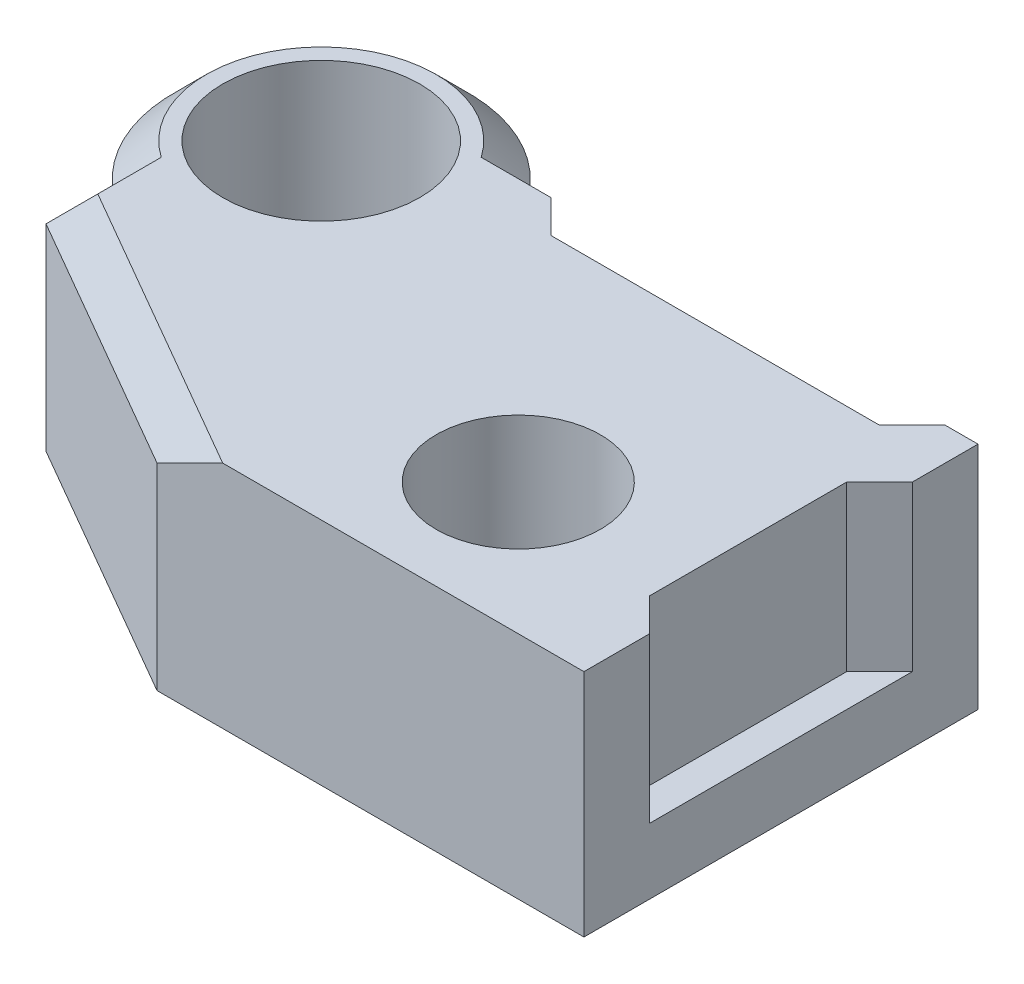
ISO-10303-21;
HEADER;
FILE_DESCRIPTION(('STEP AP214'),'2;1');
FILE_NAME('part.step','',(''),(''),'','','');
FILE_SCHEMA(('AUTOMOTIVE_DESIGN { 1 0 10303 214 1 1 1 1 }'));
ENDSEC;
DATA;
#1=APPLICATION_CONTEXT('core data for automotive mechanical design processes');
#2=APPLICATION_PROTOCOL_DEFINITION('international standard','automotive_design',2000,#1);
#3=PRODUCT_CONTEXT('',#1,'mechanical');
#4=PRODUCT('Part','Part','',(#3));
#5=PRODUCT_RELATED_PRODUCT_CATEGORY('part','',(#4));
#6=PRODUCT_DEFINITION_FORMATION('','',#4);
#7=PRODUCT_DEFINITION_CONTEXT('part definition',#1,'design');
#8=PRODUCT_DEFINITION('design','',#6,#7);
#9=PRODUCT_DEFINITION_SHAPE('','',#8);
#10=(LENGTH_UNIT() NAMED_UNIT(*) SI_UNIT(.MILLI.,.METRE.));
#11=(NAMED_UNIT(*) PLANE_ANGLE_UNIT() SI_UNIT($,.RADIAN.));
#12=(NAMED_UNIT(*) SI_UNIT($,.STERADIAN.) SOLID_ANGLE_UNIT());
#13=UNCERTAINTY_MEASURE_WITH_UNIT(LENGTH_MEASURE(1.E-05),#10,'distance_accuracy_value','');
#14=(GEOMETRIC_REPRESENTATION_CONTEXT(3) GLOBAL_UNCERTAINTY_ASSIGNED_CONTEXT((#13)) GLOBAL_UNIT_ASSIGNED_CONTEXT((#10,
#11,#12)) REPRESENTATION_CONTEXT('',''));
#15=CARTESIAN_POINT('',(0.,0.,0.));
#16=DIRECTION('',(0.,0.,1.));
#17=DIRECTION('',(1.,0.,0.));
#18=AXIS2_PLACEMENT_3D('',#15,#16,#17);
#19=CARTESIAN_POINT('',(-4.84435562925362,35.,-20.));
#20=DIRECTION('',(0.,0.,-1.));
#21=DIRECTION('',(-1.,0.,0.));
#22=AXIS2_PLACEMENT_3D('',#19,#20,#21);
#23=PLANE('',#22);
#24=DIRECTION('',(-1.,0.,0.));
#25=VECTOR('',#24,1.);
#26=CARTESIAN_POINT('',(0.,10.,-20.));
#27=LINE('',#26,#25);
#28=CARTESIAN_POINT('',(60.,10.,-20.));
#29=VERTEX_POINT('',#28);
#30=CARTESIAN_POINT('',(0.,10.,-20.));
#31=VERTEX_POINT('',#30);
#32=EDGE_CURVE('E172',#29,#31,#27,.T.);
#33=ORIENTED_EDGE('',*,*,#32,.F.);
#34=DIRECTION('',(0.,-1.,0.));
#35=VECTOR('',#34,1.);
#36=CARTESIAN_POINT('',(60.,95.2079728939615,-20.));
#37=LINE('',#36,#35);
#38=CARTESIAN_POINT('',(60.,35.,-20.));
#39=VERTEX_POINT('',#38);
#40=EDGE_CURVE('E157',#39,#29,#37,.T.);
#41=ORIENTED_EDGE('',*,*,#40,.F.);
#42=DIRECTION('',(1.,0.,0.));
#43=VECTOR('',#42,1.);
#44=CARTESIAN_POINT('',(-4.84435562925362,35.,-20.));
#45=LINE('',#44,#43);
#46=CARTESIAN_POINT('',(65.,35.,-20.));
#47=VERTEX_POINT('',#46);
#48=EDGE_CURVE('E169',#39,#47,#45,.T.);
#49=ORIENTED_EDGE('',*,*,#48,.T.);
#50=DIRECTION('',(0.,-1.,0.));
#51=VECTOR('',#50,1.);
#52=CARTESIAN_POINT('',(65.,35.,-20.));
#53=LINE('',#52,#51);
#54=CARTESIAN_POINT('',(65.,0.,-20.));
#55=VERTEX_POINT('',#54);
#56=EDGE_CURVE('E196',#47,#55,#53,.T.);
#57=ORIENTED_EDGE('',*,*,#56,.T.);
#58=DIRECTION('',(1.,0.,0.));
#59=VECTOR('',#58,1.);
#60=CARTESIAN_POINT('',(-4.84435562925362,0.,-20.));
#61=LINE('',#60,#59);
#62=CARTESIAN_POINT('',(-4.84435562925362,0.,-20.));
#63=VERTEX_POINT('',#62);
#64=EDGE_CURVE('E197',#63,#55,#61,.T.);
#65=ORIENTED_EDGE('',*,*,#64,.F.);
#66=DIRECTION('',(0.,-1.,0.));
#67=VECTOR('',#66,1.);
#68=CARTESIAN_POINT('',(-4.84435562925362,35.,-20.));
#69=LINE('',#68,#67);
#70=CARTESIAN_POINT('',(-4.84435562925362,30.,-20.));
#71=VERTEX_POINT('',#70);
#72=EDGE_CURVE('E212',#71,#63,#69,.T.);
#73=ORIENTED_EDGE('',*,*,#72,.F.);
#74=CARTESIAN_POINT('',(-4.84435562925362,30.,-20.));
#75=CARTESIAN_POINT('',(-5.08190477445998,30.2127955591723,-20.));
#76=CARTESIAN_POINT('',(-5.31982059114856,30.4251818299175,-20.));
#77=CARTESIAN_POINT('',(-5.796463680219,30.8490437473834,-20.));
#78=CARTESIAN_POINT('',(-6.03519095596736,31.0605193903179,-20.));
#79=CARTESIAN_POINT('',(-6.75264825460754,31.6933903284911,-20.));
#80=CARTESIAN_POINT('',(-7.23270925683391,32.1132794326035,-20.));
#81=CARTESIAN_POINT('',(-8.19716627857497,32.948098839902,-20.));
#82=CARTESIAN_POINT('',(-8.68156247165042,33.3630289429857,-20.));
#83=CARTESIAN_POINT('',(-9.41217401975395,33.9807278020433,-20.));
#84=CARTESIAN_POINT('',(-9.65639478827387,34.1858562705367,-20.));
#85=CARTESIAN_POINT('',(-10.146332216397,34.5943246195466,-20.));
#86=CARTESIAN_POINT('',(-10.3920488945089,34.7976644778563,-20.));
#87=CARTESIAN_POINT('',(-10.6385933836549,35.,-20.));
#88=B_SPLINE_CURVE_WITH_KNOTS('',3,(#74,#75,#76,#77,#78,#79,#80,#81,#82,#83,#84,#85,#86,#87),
.UNSPECIFIED.,.F.,.F.,(4,2,2,2,2,2,4),(0.,0.95676675045147,1.91353747508659,3.82685521218492,
5.74024989531519,6.69705637838347,7.65387472402372),.UNSPECIFIED.);
#89=CARTESIAN_POINT('',(-10.6385933836549,35.,-20.));
#90=VERTEX_POINT('',#89);
#91=EDGE_CURVE('E11',#71,#90,#88,.T.);
#92=ORIENTED_EDGE('',*,*,#91,.T.);
#93=CARTESIAN_POINT('',(0.,35.,-20.));
#94=VERTEX_POINT('',#93);
#95=EDGE_CURVE('E181',#90,#94,#45,.T.);
#96=ORIENTED_EDGE('',*,*,#95,.T.);
#97=DIRECTION('',(0.,-1.,0.));
#98=VECTOR('',#97,1.);
#99=CARTESIAN_POINT('',(0.,95.2079728939615,-20.));
#100=LINE('',#99,#98);
#101=EDGE_CURVE('E296',#94,#31,#100,.T.);
#102=ORIENTED_EDGE('',*,*,#101,.T.);
#103=EDGE_LOOP('',(#33,#41,#49,#57,#65,#73,#92,#96,#102));
#104=FACE_BOUND('',#103,.T.);
#105=ADVANCED_FACE('F35',(#104),#23,.T.);
#106=CARTESIAN_POINT('',(65.,35.,-20.));
#107=DIRECTION('',(1.,0.,0.));
#108=DIRECTION('',(0.,0.,-1.));
#109=AXIS2_PLACEMENT_3D('',#106,#107,#108);
#110=PLANE('',#109);
#111=DIRECTION('',(0.,0.,-1.));
#112=VECTOR('',#111,1.);
#113=CARTESIAN_POINT('',(65.,10.,-10.));
#114=LINE('',#113,#112);
#115=CARTESIAN_POINT('',(65.,10.,30.));
#116=VERTEX_POINT('',#115);
#117=CARTESIAN_POINT('',(65.,10.,-10.));
#118=VERTEX_POINT('',#117);
#119=EDGE_CURVE('E310',#116,#118,#114,.T.);
#120=ORIENTED_EDGE('',*,*,#119,.F.);
#121=DIRECTION('',(0.,-1.,0.));
#122=VECTOR('',#121,1.);
#123=CARTESIAN_POINT('',(65.,95.2079728939615,30.));
#124=LINE('',#123,#122);
#125=CARTESIAN_POINT('',(65.,35.,30.));
#126=VERTEX_POINT('',#125);
#127=EDGE_CURVE('E276',#126,#116,#124,.T.);
#128=ORIENTED_EDGE('',*,*,#127,.F.);
#129=DIRECTION('',(0.,0.,1.));
#130=VECTOR('',#129,1.);
#131=CARTESIAN_POINT('',(65.,35.,-20.));
#132=LINE('',#131,#130);
#133=CARTESIAN_POINT('',(65.,35.,40.));
#134=VERTEX_POINT('',#133);
#135=EDGE_CURVE('E185',#126,#134,#132,.T.);
#136=ORIENTED_EDGE('',*,*,#135,.T.);
#137=DIRECTION('',(0.,-1.,0.));
#138=VECTOR('',#137,1.);
#139=CARTESIAN_POINT('',(65.,35.,40.));
#140=LINE('',#139,#138);
#141=CARTESIAN_POINT('',(65.,0.,40.));
#142=VERTEX_POINT('',#141);
#143=EDGE_CURVE('E221',#134,#142,#140,.T.);
#144=ORIENTED_EDGE('',*,*,#143,.T.);
#145=DIRECTION('',(0.,0.,1.));
#146=VECTOR('',#145,1.);
#147=CARTESIAN_POINT('',(65.,0.,-20.));
#148=LINE('',#147,#146);
#149=EDGE_CURVE('E200',#55,#142,#148,.T.);
#150=ORIENTED_EDGE('',*,*,#149,.F.);
#151=ORIENTED_EDGE('',*,*,#56,.F.);
#152=CARTESIAN_POINT('',(65.,35.,-10.));
#153=VERTEX_POINT('',#152);
#154=EDGE_CURVE('E180',#47,#153,#132,.T.);
#155=ORIENTED_EDGE('',*,*,#154,.T.);
#156=DIRECTION('',(0.,-1.,0.));
#157=VECTOR('',#156,1.);
#158=CARTESIAN_POINT('',(65.,95.2079728939615,-10.));
#159=LINE('',#158,#157);
#160=EDGE_CURVE('E309',#153,#118,#159,.T.);
#161=ORIENTED_EDGE('',*,*,#160,.T.);
#162=EDGE_LOOP('',(#120,#128,#136,#144,#150,#151,#155,#161));
#163=FACE_BOUND('',#162,.T.);
#164=ADVANCED_FACE('F252',(#163),#110,.T.);
#165=CARTESIAN_POINT('',(-25.,35.,-10.));
#166=DIRECTION('',(0.,1.,0.));
#167=DIRECTION('',(0.,0.,1.));
#168=AXIS2_PLACEMENT_3D('',#165,#166,#167);
#169=PLANE('',#168);
#170=ORIENTED_EDGE('',*,*,#95,.F.);
#171=CARTESIAN_POINT('',(-25.,35.,-10.));
#172=DIRECTION('',(0.,1.,0.));
#173=DIRECTION('',(0.,0.,1.));
#174=AXIS2_PLACEMENT_3D('',#171,#172,#173);
#175=CIRCLE('',#174,17.5);
#176=CARTESIAN_POINT('',(-35.,35.,4.36140661634506));
#177=VERTEX_POINT('',#176);
#178=EDGE_CURVE('E231',#90,#177,#175,.T.);
#179=ORIENTED_EDGE('',*,*,#178,.T.);
#180=DIRECTION('',(0.,0.,1.));
#181=VECTOR('',#180,1.);
#182=CARTESIAN_POINT('',(-35.,35.,16.9059892324149));
#183=LINE('',#182,#181);
#184=CARTESIAN_POINT('',(-35.,35.,14.0192378864668));
#185=VERTEX_POINT('',#184);
#186=EDGE_CURVE('E214',#177,#185,#183,.T.);
#187=ORIENTED_EDGE('',*,*,#186,.T.);
#188=DIRECTION('',(0.866025403784438,0.,0.500000000000001));
#189=VECTOR('',#188,1.);
#190=CARTESIAN_POINT('',(2.5,35.,35.6698729810778));
#191=LINE('',#190,#189);
#192=CARTESIAN_POINT('',(9.99999999999998,35.,40.));
#193=VERTEX_POINT('',#192);
#194=EDGE_CURVE('E233',#185,#193,#191,.T.);
#195=ORIENTED_EDGE('',*,*,#194,.T.);
#196=DIRECTION('',(1.,0.,0.));
#197=VECTOR('',#196,1.);
#198=CARTESIAN_POINT('',(0.,35.,40.));
#199=LINE('',#198,#197);
#200=EDGE_CURVE('E194',#193,#134,#199,.T.);
#201=ORIENTED_EDGE('',*,*,#200,.T.);
#202=ORIENTED_EDGE('',*,*,#135,.F.);
#203=DIRECTION('',(0.70710678118655,0.,0.707106781186545));
#204=VECTOR('',#203,1.);
#205=CARTESIAN_POINT('',(60.,35.,25.));
#206=LINE('',#205,#204);
#207=CARTESIAN_POINT('',(60.,35.,25.));
#208=VERTEX_POINT('',#207);
#209=EDGE_CURVE('E313',#208,#126,#206,.T.);
#210=ORIENTED_EDGE('',*,*,#209,.F.);
#211=DIRECTION('',(0.,0.,1.));
#212=VECTOR('',#211,1.);
#213=CARTESIAN_POINT('',(60.,35.,-4.99999999999997));
#214=LINE('',#213,#212);
#215=CARTESIAN_POINT('',(60.,35.,-4.99999999999997));
#216=VERTEX_POINT('',#215);
#217=EDGE_CURVE('E305',#216,#208,#214,.T.);
#218=ORIENTED_EDGE('',*,*,#217,.F.);
#219=DIRECTION('',(-0.707106781186546,0.,0.707106781186549));
#220=VECTOR('',#219,1.);
#221=CARTESIAN_POINT('',(60.,35.,-4.99999999999997));
#222=LINE('',#221,#220);
#223=EDGE_CURVE('E302',#153,#216,#222,.T.);
#224=ORIENTED_EDGE('',*,*,#223,.F.);
#225=ORIENTED_EDGE('',*,*,#154,.F.);
#226=ORIENTED_EDGE('',*,*,#48,.F.);
#227=DIRECTION('',(0.707106781186547,0.,-0.707106781186548));
#228=VECTOR('',#227,1.);
#229=CARTESIAN_POINT('',(55.,35.,-15.));
#230=LINE('',#229,#228);
#231=CARTESIAN_POINT('',(55.,35.,-15.));
#232=VERTEX_POINT('',#231);
#233=EDGE_CURVE('E153',#232,#39,#230,.T.);
#234=ORIENTED_EDGE('',*,*,#233,.F.);
#235=DIRECTION('',(1.,0.,0.));
#236=VECTOR('',#235,1.);
#237=CARTESIAN_POINT('',(5.00000000000001,35.,-15.));
#238=LINE('',#237,#236);
#239=CARTESIAN_POINT('',(5.00000000000001,35.,-15.));
#240=VERTEX_POINT('',#239);
#241=EDGE_CURVE('E165',#240,#232,#238,.T.);
#242=ORIENTED_EDGE('',*,*,#241,.F.);
#243=DIRECTION('',(0.707106781186551,0.,0.707106781186544));
#244=VECTOR('',#243,1.);
#245=CARTESIAN_POINT('',(5.00000000000001,35.,-15.));
#246=LINE('',#245,#244);
#247=EDGE_CURVE('E164',#94,#240,#246,.T.);
#248=ORIENTED_EDGE('',*,*,#247,.F.);
#249=EDGE_LOOP('',(#170,#179,#187,#195,#201,#202,#210,#218,#224,#225,#226,#234,#242,#248));
#250=FACE_BOUND('',#249,.T.);
#251=CARTESIAN_POINT('',(35.,35.,20.));
#252=DIRECTION('',(0.,1.,0.));
#253=DIRECTION('',(0.,0.,1.));
#254=AXIS2_PLACEMENT_3D('',#251,#252,#253);
#255=CIRCLE('',#254,12.5);
#256=CARTESIAN_POINT('',(35.,35.,32.5));
#257=VERTEX_POINT('',#256);
#258=EDGE_CURVE('E227',#257,#257,#255,.T.);
#259=ORIENTED_EDGE('',*,*,#258,.F.);
#260=EDGE_LOOP('',(#259));
#261=FACE_BOUND('',#260,.T.);
#262=CARTESIAN_POINT('',(-25.,35.,-10.));
#263=DIRECTION('',(0.,1.,0.));
#264=DIRECTION('',(0.,0.,1.));
#265=AXIS2_PLACEMENT_3D('',#262,#263,#264);
#266=CIRCLE('',#265,15.);
#267=CARTESIAN_POINT('',(-25.,35.,5.));
#268=VERTEX_POINT('',#267);
#269=EDGE_CURVE('E191',#268,#268,#266,.T.);
#270=ORIENTED_EDGE('',*,*,#269,.F.);
#271=EDGE_LOOP('',(#270));
#272=FACE_BOUND('',#271,.T.);
#273=ADVANCED_FACE('F176',(#250,#261,#272),#169,.T.);
#274=CARTESIAN_POINT('',(-25.,35.,-10.));
#275=DIRECTION('',(0.,-1.,0.));
#276=DIRECTION('',(0.,0.,-1.));
#277=AXIS2_PLACEMENT_3D('',#274,#275,#276);
#278=CYLINDRICAL_SURFACE('',#277,22.5);
#279=DIRECTION('',(0.,-1.,0.));
#280=VECTOR('',#279,1.);
#281=CARTESIAN_POINT('',(-40.,35.,6.77050983124841));
#282=LINE('',#281,#280);
#283=CARTESIAN_POINT('',(-40.,30.,6.77050983124841));
#284=VERTEX_POINT('',#283);
#285=CARTESIAN_POINT('',(-40.,0.,6.77050983124841));
#286=VERTEX_POINT('',#285);
#287=EDGE_CURVE('E215',#284,#286,#282,.T.);
#288=ORIENTED_EDGE('',*,*,#287,.F.);
#289=CARTESIAN_POINT('',(-25.,30.,-10.));
#290=DIRECTION('',(0.,1.,0.));
#291=DIRECTION('',(0.,0.,1.));
#292=AXIS2_PLACEMENT_3D('',#289,#290,#291);
#293=CIRCLE('',#292,22.5);
#294=EDGE_CURVE('E56',#284,#71,#293,.F.);
#295=ORIENTED_EDGE('',*,*,#294,.T.);
#296=ORIENTED_EDGE('',*,*,#72,.T.);
#297=CARTESIAN_POINT('',(-25.,0.,-10.));
#298=DIRECTION('',(0.,1.,0.));
#299=DIRECTION('',(0.,0.,1.));
#300=AXIS2_PLACEMENT_3D('',#297,#298,#299);
#301=CIRCLE('',#300,22.5);
#302=EDGE_CURVE('E182',#63,#286,#301,.T.);
#303=ORIENTED_EDGE('',*,*,#302,.T.);
#304=EDGE_LOOP('',(#288,#295,#296,#303));
#305=FACE_BOUND('',#304,.T.);
#306=ADVANCED_FACE('F387',(#305),#278,.T.);
#307=CARTESIAN_POINT('',(-40.,35.,6.77050983124841));
#308=DIRECTION('',(1.,0.,0.));
#309=DIRECTION('',(0.,0.,-1.));
#310=AXIS2_PLACEMENT_3D('',#307,#308,#309);
#311=PLANE('',#310);
#312=DIRECTION('',(0.,-1.,0.));
#313=VECTOR('',#312,1.);
#314=CARTESIAN_POINT('',(-40.,35.,16.9059892324149));
#315=LINE('',#314,#313);
#316=CARTESIAN_POINT('',(-40.,30.,16.9059892324149));
#317=VERTEX_POINT('',#316);
#318=CARTESIAN_POINT('',(-40.,0.,16.9059892324149));
#319=VERTEX_POINT('',#318);
#320=EDGE_CURVE('E217',#317,#319,#315,.T.);
#321=ORIENTED_EDGE('',*,*,#320,.F.);
#322=DIRECTION('',(0.,0.,-1.));
#323=VECTOR('',#322,1.);
#324=CARTESIAN_POINT('',(-40.,30.,6.77050983124841));
#325=LINE('',#324,#323);
#326=EDGE_CURVE('E48',#317,#284,#325,.T.);
#327=ORIENTED_EDGE('',*,*,#326,.T.);
#328=ORIENTED_EDGE('',*,*,#287,.T.);
#329=DIRECTION('',(0.,0.,1.));
#330=VECTOR('',#329,1.);
#331=CARTESIAN_POINT('',(-40.,0.,6.77050983124841));
#332=LINE('',#331,#330);
#333=EDGE_CURVE('E187',#286,#319,#332,.T.);
#334=ORIENTED_EDGE('',*,*,#333,.T.);
#335=EDGE_LOOP('',(#321,#327,#328,#334));
#336=FACE_BOUND('',#335,.T.);
#337=ADVANCED_FACE('F393',(#336),#311,.F.);
#338=CARTESIAN_POINT('',(-40.,35.,16.9059892324149));
#339=DIRECTION('',(0.500000000000001,0.,-0.866025403784438));
#340=DIRECTION('',(-0.866025403784438,0.,-0.500000000000001));
#341=AXIS2_PLACEMENT_3D('',#338,#339,#340);
#342=PLANE('',#341);
#343=DIRECTION('',(0.,-1.,0.));
#344=VECTOR('',#343,1.);
#345=CARTESIAN_POINT('',(0.,35.,40.));
#346=LINE('',#345,#344);
#347=CARTESIAN_POINT('',(0.,30.,40.));
#348=VERTEX_POINT('',#347);
#349=CARTESIAN_POINT('',(0.,0.,40.));
#350=VERTEX_POINT('',#349);
#351=EDGE_CURVE('E219',#348,#350,#346,.T.);
#352=ORIENTED_EDGE('',*,*,#351,.F.);
#353=DIRECTION('',(-0.866025403784438,0.,-0.500000000000001));
#354=VECTOR('',#353,1.);
#355=CARTESIAN_POINT('',(-40.,30.,16.9059892324149));
#356=LINE('',#355,#354);
#357=EDGE_CURVE('E238',#348,#317,#356,.T.);
#358=ORIENTED_EDGE('',*,*,#357,.T.);
#359=ORIENTED_EDGE('',*,*,#320,.T.);
#360=DIRECTION('',(0.866025403784438,0.,0.500000000000001));
#361=VECTOR('',#360,1.);
#362=CARTESIAN_POINT('',(-40.,0.,16.9059892324149));
#363=LINE('',#362,#361);
#364=EDGE_CURVE('E207',#319,#350,#363,.T.);
#365=ORIENTED_EDGE('',*,*,#364,.T.);
#366=EDGE_LOOP('',(#352,#358,#359,#365));
#367=FACE_BOUND('',#366,.T.);
#368=ADVANCED_FACE('F396',(#367),#342,.F.);
#369=CARTESIAN_POINT('',(0.,35.,40.));
#370=DIRECTION('',(0.,0.,-1.));
#371=DIRECTION('',(-1.,0.,0.));
#372=AXIS2_PLACEMENT_3D('',#369,#370,#371);
#373=PLANE('',#372);
#374=ORIENTED_EDGE('',*,*,#200,.F.);
#375=DIRECTION('',(-0.894427190999914,-0.447213595499961,0.));
#376=VECTOR('',#375,1.);
#377=CARTESIAN_POINT('',(-28.3205080756886,15.8397459621555,40.));
#378=LINE('',#377,#376);
#379=EDGE_CURVE('E236',#193,#348,#378,.T.);
#380=ORIENTED_EDGE('',*,*,#379,.T.);
#381=ORIENTED_EDGE('',*,*,#351,.T.);
#382=DIRECTION('',(1.,0.,0.));
#383=VECTOR('',#382,1.);
#384=CARTESIAN_POINT('',(0.,0.,40.));
#385=LINE('',#384,#383);
#386=EDGE_CURVE('E204',#350,#142,#385,.T.);
#387=ORIENTED_EDGE('',*,*,#386,.T.);
#388=ORIENTED_EDGE('',*,*,#143,.F.);
#389=EDGE_LOOP('',(#374,#380,#381,#387,#388));
#390=FACE_BOUND('',#389,.T.);
#391=ADVANCED_FACE('F337',(#390),#373,.F.);
#392=CARTESIAN_POINT('',(-25.,0.,-10.));
#393=DIRECTION('',(0.,1.,0.));
#394=DIRECTION('',(0.,0.,1.));
#395=AXIS2_PLACEMENT_3D('',#392,#393,#394);
#396=PLANE('',#395);
#397=CARTESIAN_POINT('',(35.,0.,20.));
#398=DIRECTION('',(0.,1.,0.));
#399=DIRECTION('',(0.,0.,1.));
#400=AXIS2_PLACEMENT_3D('',#397,#398,#399);
#401=CIRCLE('',#400,12.5);
#402=CARTESIAN_POINT('',(35.,0.,32.5));
#403=VERTEX_POINT('',#402);
#404=EDGE_CURVE('E201',#403,#403,#401,.T.);
#405=ORIENTED_EDGE('',*,*,#404,.T.);
#406=EDGE_LOOP('',(#405));
#407=FACE_BOUND('',#406,.T.);
#408=CARTESIAN_POINT('',(-25.,0.,-10.));
#409=DIRECTION('',(0.,1.,0.));
#410=DIRECTION('',(0.,0.,1.));
#411=AXIS2_PLACEMENT_3D('',#408,#409,#410);
#412=CIRCLE('',#411,15.);
#413=CARTESIAN_POINT('',(-25.,0.,5.));
#414=VERTEX_POINT('',#413);
#415=EDGE_CURVE('E224',#414,#414,#412,.T.);
#416=ORIENTED_EDGE('',*,*,#415,.T.);
#417=EDGE_LOOP('',(#416));
#418=FACE_BOUND('',#417,.T.);
#419=ORIENTED_EDGE('',*,*,#64,.T.);
#420=ORIENTED_EDGE('',*,*,#149,.T.);
#421=ORIENTED_EDGE('',*,*,#386,.F.);
#422=ORIENTED_EDGE('',*,*,#364,.F.);
#423=ORIENTED_EDGE('',*,*,#333,.F.);
#424=ORIENTED_EDGE('',*,*,#302,.F.);
#425=EDGE_LOOP('',(#419,#420,#421,#422,#423,#424));
#426=FACE_BOUND('',#425,.T.);
#427=ADVANCED_FACE('F344',(#407,#418,#426),#396,.F.);
#428=CARTESIAN_POINT('',(-25.,-1.2E-05,-10.));
#429=DIRECTION('',(0.,1.,0.));
#430=DIRECTION('',(0.,0.,1.));
#431=AXIS2_PLACEMENT_3D('',#428,#429,#430);
#432=CYLINDRICAL_SURFACE('',#431,15.);
#433=CARTESIAN_POINT('',(-25.,35.,5.));
#434=CARTESIAN_POINT('',(-25.,34.6354166666667,5.));
#435=CARTESIAN_POINT('',(-25.,34.2708333333333,5.));
#436=CARTESIAN_POINT('',(-25.,33.5416666666667,5.));
#437=CARTESIAN_POINT('',(-25.,33.1770833333333,5.));
#438=CARTESIAN_POINT('',(-25.,32.4479166666667,5.));
#439=CARTESIAN_POINT('',(-25.,32.0833333333333,5.));
#440=CARTESIAN_POINT('',(-25.,31.3541666666667,5.));
#441=CARTESIAN_POINT('',(-25.,30.9895833333333,5.));
#442=CARTESIAN_POINT('',(-25.,30.2604166666667,5.));
#443=CARTESIAN_POINT('',(-25.,29.8958333333333,5.));
#444=CARTESIAN_POINT('',(-25.,29.1666666666667,5.));
#445=CARTESIAN_POINT('',(-25.,28.8020833333333,5.));
#446=CARTESIAN_POINT('',(-25.,28.0729166666667,5.));
#447=CARTESIAN_POINT('',(-25.,27.7083333333333,5.));
#448=CARTESIAN_POINT('',(-25.,26.9791666666667,5.));
#449=CARTESIAN_POINT('',(-25.,26.6145833333333,5.));
#450=CARTESIAN_POINT('',(-25.,25.8854166666667,5.));
#451=CARTESIAN_POINT('',(-25.,25.5208333333333,5.));
#452=CARTESIAN_POINT('',(-25.,24.7916666666667,5.));
#453=CARTESIAN_POINT('',(-25.,24.4270833333333,5.));
#454=CARTESIAN_POINT('',(-25.,23.6979166666667,5.));
#455=CARTESIAN_POINT('',(-25.,23.3333333333333,5.));
#456=CARTESIAN_POINT('',(-25.,22.6041666666667,5.));
#457=CARTESIAN_POINT('',(-25.,22.2395833333333,5.));
#458=CARTESIAN_POINT('',(-25.,21.5104166666667,5.));
#459=CARTESIAN_POINT('',(-25.,21.1458333333333,5.));
#460=CARTESIAN_POINT('',(-25.,20.4166666666667,5.));
#461=CARTESIAN_POINT('',(-25.,20.0520833333333,5.));
#462=CARTESIAN_POINT('',(-25.,19.3229166666667,5.));
#463=CARTESIAN_POINT('',(-25.,18.9583333333333,5.));
#464=CARTESIAN_POINT('',(-25.,18.2291666666667,5.));
#465=CARTESIAN_POINT('',(-25.,17.8645833333333,5.));
#466=CARTESIAN_POINT('',(-25.,17.1354166666667,5.));
#467=CARTESIAN_POINT('',(-25.,16.7708333333333,5.));
#468=CARTESIAN_POINT('',(-25.,16.0416666666667,5.));
#469=CARTESIAN_POINT('',(-25.,15.6770833333333,5.));
#470=CARTESIAN_POINT('',(-25.,14.9479166666667,5.));
#471=CARTESIAN_POINT('',(-25.,14.5833333333333,5.));
#472=CARTESIAN_POINT('',(-25.,13.8541666666667,5.));
#473=CARTESIAN_POINT('',(-25.,13.4895833333333,5.));
#474=CARTESIAN_POINT('',(-25.,12.7604166666667,5.));
#475=CARTESIAN_POINT('',(-25.,12.3958333333333,5.));
#476=CARTESIAN_POINT('',(-25.,11.6666666666667,5.));
#477=CARTESIAN_POINT('',(-25.,11.3020833333333,5.));
#478=CARTESIAN_POINT('',(-25.,10.5729166666667,5.));
#479=CARTESIAN_POINT('',(-25.,10.2083333333333,5.));
#480=CARTESIAN_POINT('',(-25.,9.47916666666667,5.));
#481=CARTESIAN_POINT('',(-25.,9.11458333333333,5.));
#482=CARTESIAN_POINT('',(-25.,8.38541666666667,5.));
#483=CARTESIAN_POINT('',(-25.,8.02083333333333,5.));
#484=CARTESIAN_POINT('',(-25.,7.29166666666667,5.));
#485=CARTESIAN_POINT('',(-25.,6.92708333333334,5.));
#486=CARTESIAN_POINT('',(-25.,6.19791666666667,5.));
#487=CARTESIAN_POINT('',(-25.,5.83333333333334,5.));
#488=CARTESIAN_POINT('',(-25.,5.10416666666667,5.));
#489=CARTESIAN_POINT('',(-25.,4.73958333333333,5.));
#490=CARTESIAN_POINT('',(-25.,4.01041666666667,5.));
#491=CARTESIAN_POINT('',(-25.,3.64583333333333,5.));
#492=CARTESIAN_POINT('',(-25.,2.91666666666667,5.));
#493=CARTESIAN_POINT('',(-25.,2.55208333333333,5.));
#494=CARTESIAN_POINT('',(-25.,1.82291666666667,5.));
#495=CARTESIAN_POINT('',(-25.,1.45833333333333,5.));
#496=CARTESIAN_POINT('',(-25.,0.729166666666666,5.));
#497=CARTESIAN_POINT('',(-25.,0.364583333333334,5.));
#498=CARTESIAN_POINT('',(-25.,0.,5.));
#499=B_SPLINE_CURVE_WITH_KNOTS('',3,(#433,#434,#435,#436,#437,#438,#439,#440,#441,#442,#443,
#444,#445,#446,#447,#448,#449,#450,#451,#452,#453,#454,#455,#456,#457,#458,#459,#460,#461,#462,
#463,#464,#465,#466,#467,#468,#469,#470,#471,#472,#473,#474,#475,#476,#477,#478,#479,#480,#481,
#482,#483,#484,#485,#486,#487,#488,#489,#490,#491,#492,#493,#494,#495,#496,#497,#498),
.UNSPECIFIED.,.F.,.F.,(4,2,2,2,2,2,2,2,2,2,2,2,2,2,2,2,2,2,2,2,2,2,2,2,2,2,2,2,2,2,2,2,4),(0.,
1.09375,2.1875,3.28125,4.375,5.46875,6.5625,7.65625,8.75,9.84375,10.9375,12.03125,13.125,
14.21875,15.3125,16.40625,17.5,18.59375,19.6875,20.78125,21.875,22.96875,24.0625,25.15625,26.25,
27.34375,28.4375,29.53125,30.625,31.71875,32.8125,33.90625,35.),.UNSPECIFIED.);
#500=EDGE_CURVE('BSEAM382',#268,#414,#499,.T.);
#501=ORIENTED_EDGE('',*,*,#269,.T.);
#502=ORIENTED_EDGE('',*,*,#415,.F.);
#503=ORIENTED_EDGE('',*,*,#500,.T.);
#504=ORIENTED_EDGE('',*,*,#500,.F.);
#505=EDGE_LOOP('',(#501,#503,#502,#504));
#506=FACE_BOUND('',#505,.T.);
#507=ADVANCED_FACE('F382',(#506),#432,.F.);
#508=CARTESIAN_POINT('',(35.,-1.2E-05,20.));
#509=DIRECTION('',(0.,1.,0.));
#510=DIRECTION('',(0.,0.,1.));
#511=AXIS2_PLACEMENT_3D('',#508,#509,#510);
#512=CYLINDRICAL_SURFACE('',#511,12.5);
#513=CARTESIAN_POINT('',(35.,35.,32.5));
#514=CARTESIAN_POINT('',(35.,34.6354166666667,32.5));
#515=CARTESIAN_POINT('',(35.,34.2708333333333,32.5));
#516=CARTESIAN_POINT('',(35.,33.5416666666667,32.5));
#517=CARTESIAN_POINT('',(35.,33.1770833333333,32.5));
#518=CARTESIAN_POINT('',(35.,32.4479166666667,32.5));
#519=CARTESIAN_POINT('',(35.,32.0833333333333,32.5));
#520=CARTESIAN_POINT('',(35.,31.3541666666667,32.5));
#521=CARTESIAN_POINT('',(35.,30.9895833333333,32.5));
#522=CARTESIAN_POINT('',(35.,30.2604166666667,32.5));
#523=CARTESIAN_POINT('',(35.,29.8958333333333,32.5));
#524=CARTESIAN_POINT('',(35.,29.1666666666667,32.5));
#525=CARTESIAN_POINT('',(35.,28.8020833333333,32.5));
#526=CARTESIAN_POINT('',(35.,28.0729166666667,32.5));
#527=CARTESIAN_POINT('',(35.,27.7083333333333,32.5));
#528=CARTESIAN_POINT('',(35.,26.9791666666667,32.5));
#529=CARTESIAN_POINT('',(35.,26.6145833333333,32.5));
#530=CARTESIAN_POINT('',(35.,25.8854166666667,32.5));
#531=CARTESIAN_POINT('',(35.,25.5208333333333,32.5));
#532=CARTESIAN_POINT('',(35.,24.7916666666667,32.5));
#533=CARTESIAN_POINT('',(35.,24.4270833333333,32.5));
#534=CARTESIAN_POINT('',(35.,23.6979166666667,32.5));
#535=CARTESIAN_POINT('',(35.,23.3333333333333,32.5));
#536=CARTESIAN_POINT('',(35.,22.6041666666667,32.5));
#537=CARTESIAN_POINT('',(35.,22.2395833333333,32.5));
#538=CARTESIAN_POINT('',(35.,21.5104166666667,32.5));
#539=CARTESIAN_POINT('',(35.,21.1458333333333,32.5));
#540=CARTESIAN_POINT('',(35.,20.4166666666667,32.5));
#541=CARTESIAN_POINT('',(35.,20.0520833333333,32.5));
#542=CARTESIAN_POINT('',(35.,19.3229166666667,32.5));
#543=CARTESIAN_POINT('',(35.,18.9583333333333,32.5));
#544=CARTESIAN_POINT('',(35.,18.2291666666667,32.5));
#545=CARTESIAN_POINT('',(35.,17.8645833333333,32.5));
#546=CARTESIAN_POINT('',(35.,17.1354166666667,32.5));
#547=CARTESIAN_POINT('',(35.,16.7708333333333,32.5));
#548=CARTESIAN_POINT('',(35.,16.0416666666667,32.5));
#549=CARTESIAN_POINT('',(35.,15.6770833333333,32.5));
#550=CARTESIAN_POINT('',(35.,14.9479166666667,32.5));
#551=CARTESIAN_POINT('',(35.,14.5833333333333,32.5));
#552=CARTESIAN_POINT('',(35.,13.8541666666667,32.5));
#553=CARTESIAN_POINT('',(35.,13.4895833333333,32.5));
#554=CARTESIAN_POINT('',(35.,12.7604166666667,32.5));
#555=CARTESIAN_POINT('',(35.,12.3958333333333,32.5));
#556=CARTESIAN_POINT('',(35.,11.6666666666667,32.5));
#557=CARTESIAN_POINT('',(35.,11.3020833333333,32.5));
#558=CARTESIAN_POINT('',(35.,10.5729166666667,32.5));
#559=CARTESIAN_POINT('',(35.,10.2083333333333,32.5));
#560=CARTESIAN_POINT('',(35.,9.47916666666667,32.5));
#561=CARTESIAN_POINT('',(35.,9.11458333333333,32.5));
#562=CARTESIAN_POINT('',(35.,8.38541666666667,32.5));
#563=CARTESIAN_POINT('',(35.,8.02083333333333,32.5));
#564=CARTESIAN_POINT('',(35.,7.29166666666667,32.5));
#565=CARTESIAN_POINT('',(35.,6.92708333333334,32.5));
#566=CARTESIAN_POINT('',(35.,6.19791666666667,32.5));
#567=CARTESIAN_POINT('',(35.,5.83333333333334,32.5));
#568=CARTESIAN_POINT('',(35.,5.10416666666667,32.5));
#569=CARTESIAN_POINT('',(35.,4.73958333333333,32.5));
#570=CARTESIAN_POINT('',(35.,4.01041666666667,32.5));
#571=CARTESIAN_POINT('',(35.,3.64583333333333,32.5));
#572=CARTESIAN_POINT('',(35.,2.91666666666667,32.5));
#573=CARTESIAN_POINT('',(35.,2.55208333333333,32.5));
#574=CARTESIAN_POINT('',(35.,1.82291666666667,32.5));
#575=CARTESIAN_POINT('',(35.,1.45833333333333,32.5));
#576=CARTESIAN_POINT('',(35.,0.729166666666666,32.5));
#577=CARTESIAN_POINT('',(35.,0.364583333333334,32.5));
#578=CARTESIAN_POINT('',(35.,0.,32.5));
#579=B_SPLINE_CURVE_WITH_KNOTS('',3,(#513,#514,#515,#516,#517,#518,#519,#520,#521,#522,#523,
#524,#525,#526,#527,#528,#529,#530,#531,#532,#533,#534,#535,#536,#537,#538,#539,#540,#541,#542,
#543,#544,#545,#546,#547,#548,#549,#550,#551,#552,#553,#554,#555,#556,#557,#558,#559,#560,#561,
#562,#563,#564,#565,#566,#567,#568,#569,#570,#571,#572,#573,#574,#575,#576,#577,#578),
.UNSPECIFIED.,.F.,.F.,(4,2,2,2,2,2,2,2,2,2,2,2,2,2,2,2,2,2,2,2,2,2,2,2,2,2,2,2,2,2,2,2,4),(0.,
1.09375,2.1875,3.28125,4.375,5.46875,6.5625,7.65625,8.75,9.84375,10.9375,12.03125,13.125,
14.21875,15.3125,16.40625,17.5,18.59375,19.6875,20.78125,21.875,22.96875,24.0625,25.15625,26.25,
27.34375,28.4375,29.53125,30.625,31.71875,32.8125,33.90625,35.),.UNSPECIFIED.);
#580=EDGE_CURVE('BSEAM379',#257,#403,#579,.T.);
#581=ORIENTED_EDGE('',*,*,#258,.T.);
#582=ORIENTED_EDGE('',*,*,#404,.F.);
#583=ORIENTED_EDGE('',*,*,#580,.T.);
#584=ORIENTED_EDGE('',*,*,#580,.F.);
#585=EDGE_LOOP('',(#581,#583,#582,#584));
#586=FACE_BOUND('',#585,.T.);
#587=ADVANCED_FACE('F379',(#586),#512,.F.);
#588=CARTESIAN_POINT('',(60.,95.2079728939615,25.));
#589=DIRECTION('',(0.707106781186545,0.,-0.70710678118655));
#590=DIRECTION('',(-0.70710678118655,0.,-0.707106781186545));
#591=AXIS2_PLACEMENT_3D('',#588,#589,#590);
#592=PLANE('',#591);
#593=ORIENTED_EDGE('',*,*,#209,.T.);
#594=ORIENTED_EDGE('',*,*,#127,.T.);
#595=DIRECTION('',(0.70710678118655,0.,0.707106781186545));
#596=VECTOR('',#595,1.);
#597=CARTESIAN_POINT('',(60.,10.,25.));
#598=LINE('',#597,#596);
#599=CARTESIAN_POINT('',(60.,10.,25.));
#600=VERTEX_POINT('',#599);
#601=EDGE_CURVE('E269',#600,#116,#598,.T.);
#602=ORIENTED_EDGE('',*,*,#601,.F.);
#603=DIRECTION('',(0.,-1.,0.));
#604=VECTOR('',#603,1.);
#605=CARTESIAN_POINT('',(60.,95.2079728939615,25.));
#606=LINE('',#605,#604);
#607=EDGE_CURVE('E267',#208,#600,#606,.T.);
#608=ORIENTED_EDGE('',*,*,#607,.F.);
#609=EDGE_LOOP('',(#593,#594,#602,#608));
#610=FACE_BOUND('',#609,.T.);
#611=ADVANCED_FACE('F332',(#610),#592,.T.);
#612=CARTESIAN_POINT('',(60.,95.2079728939615,-4.99999999999997));
#613=DIRECTION('',(0.707106781186549,0.,0.707106781186546));
#614=DIRECTION('',(0.707106781186546,0.,-0.707106781186549));
#615=AXIS2_PLACEMENT_3D('',#612,#613,#614);
#616=PLANE('',#615);
#617=ORIENTED_EDGE('',*,*,#223,.T.);
#618=DIRECTION('',(0.,-1.,0.));
#619=VECTOR('',#618,1.);
#620=CARTESIAN_POINT('',(60.,95.2079728939615,-4.99999999999997));
#621=LINE('',#620,#619);
#622=CARTESIAN_POINT('',(60.,10.,-4.99999999999997));
#623=VERTEX_POINT('',#622);
#624=EDGE_CURVE('E279',#216,#623,#621,.T.);
#625=ORIENTED_EDGE('',*,*,#624,.T.);
#626=DIRECTION('',(-0.707106781186546,0.,0.707106781186549));
#627=VECTOR('',#626,1.);
#628=CARTESIAN_POINT('',(60.,10.,-4.99999999999997));
#629=LINE('',#628,#627);
#630=EDGE_CURVE('E306',#118,#623,#629,.T.);
#631=ORIENTED_EDGE('',*,*,#630,.F.);
#632=ORIENTED_EDGE('',*,*,#160,.F.);
#633=EDGE_LOOP('',(#617,#625,#631,#632));
#634=FACE_BOUND('',#633,.T.);
#635=ADVANCED_FACE('F322',(#634),#616,.T.);
#636=CARTESIAN_POINT('',(60.,95.2079728939615,-4.99999999999997));
#637=DIRECTION('',(1.,0.,0.));
#638=DIRECTION('',(0.,0.,-1.));
#639=AXIS2_PLACEMENT_3D('',#636,#637,#638);
#640=PLANE('',#639);
#641=ORIENTED_EDGE('',*,*,#217,.T.);
#642=ORIENTED_EDGE('',*,*,#607,.T.);
#643=DIRECTION('',(0.,0.,1.));
#644=VECTOR('',#643,1.);
#645=CARTESIAN_POINT('',(60.,10.,-4.99999999999997));
#646=LINE('',#645,#644);
#647=EDGE_CURVE('E303',#623,#600,#646,.T.);
#648=ORIENTED_EDGE('',*,*,#647,.F.);
#649=ORIENTED_EDGE('',*,*,#624,.F.);
#650=EDGE_LOOP('',(#641,#642,#648,#649));
#651=FACE_BOUND('',#650,.T.);
#652=ADVANCED_FACE('F327',(#651),#640,.T.);
#653=CARTESIAN_POINT('',(0.,10.,0.));
#654=DIRECTION('',(0.,1.,0.));
#655=DIRECTION('',(0.,0.,1.));
#656=AXIS2_PLACEMENT_3D('',#653,#654,#655);
#657=PLANE('',#656);
#658=ORIENTED_EDGE('',*,*,#601,.T.);
#659=ORIENTED_EDGE('',*,*,#119,.T.);
#660=ORIENTED_EDGE('',*,*,#630,.T.);
#661=ORIENTED_EDGE('',*,*,#647,.T.);
#662=EDGE_LOOP('',(#658,#659,#660,#661));
#663=FACE_BOUND('',#662,.T.);
#664=ADVANCED_FACE('F329',(#663),#657,.T.);
#665=CARTESIAN_POINT('',(55.,95.2079728939615,-15.));
#666=DIRECTION('',(-0.707106781186548,0.,-0.707106781186547));
#667=DIRECTION('',(-0.707106781186547,0.,0.707106781186548));
#668=AXIS2_PLACEMENT_3D('',#665,#666,#667);
#669=PLANE('',#668);
#670=ORIENTED_EDGE('',*,*,#233,.T.);
#671=ORIENTED_EDGE('',*,*,#40,.T.);
#672=DIRECTION('',(0.707106781186547,0.,-0.707106781186548));
#673=VECTOR('',#672,1.);
#674=CARTESIAN_POINT('',(55.,10.,-15.));
#675=LINE('',#674,#673);
#676=CARTESIAN_POINT('',(55.,10.,-15.));
#677=VERTEX_POINT('',#676);
#678=EDGE_CURVE('E173',#677,#29,#675,.T.);
#679=ORIENTED_EDGE('',*,*,#678,.F.);
#680=DIRECTION('',(0.,-1.,0.));
#681=VECTOR('',#680,1.);
#682=CARTESIAN_POINT('',(55.,95.2079728939615,-15.));
#683=LINE('',#682,#681);
#684=EDGE_CURVE('E159',#232,#677,#683,.T.);
#685=ORIENTED_EDGE('',*,*,#684,.F.);
#686=EDGE_LOOP('',(#670,#671,#679,#685));
#687=FACE_BOUND('',#686,.T.);
#688=ADVANCED_FACE('F155',(#687),#669,.T.);
#689=CARTESIAN_POINT('',(5.00000000000001,95.2079728939615,-15.));
#690=DIRECTION('',(0.707106781186544,0.,-0.707106781186551));
#691=DIRECTION('',(-0.707106781186551,0.,-0.707106781186544));
#692=AXIS2_PLACEMENT_3D('',#689,#690,#691);
#693=PLANE('',#692);
#694=ORIENTED_EDGE('',*,*,#247,.T.);
#695=DIRECTION('',(0.,-1.,0.));
#696=VECTOR('',#695,1.);
#697=CARTESIAN_POINT('',(5.00000000000001,95.2079728939615,-15.));
#698=LINE('',#697,#696);
#699=CARTESIAN_POINT('',(5.00000000000001,10.,-15.));
#700=VERTEX_POINT('',#699);
#701=EDGE_CURVE('E299',#240,#700,#698,.T.);
#702=ORIENTED_EDGE('',*,*,#701,.T.);
#703=DIRECTION('',(0.707106781186551,0.,0.707106781186544));
#704=VECTOR('',#703,1.);
#705=CARTESIAN_POINT('',(5.00000000000001,10.,-15.));
#706=LINE('',#705,#704);
#707=EDGE_CURVE('E298',#31,#700,#706,.T.);
#708=ORIENTED_EDGE('',*,*,#707,.F.);
#709=ORIENTED_EDGE('',*,*,#101,.F.);
#710=EDGE_LOOP('',(#694,#702,#708,#709));
#711=FACE_BOUND('',#710,.T.);
#712=ADVANCED_FACE('F350',(#711),#693,.T.);
#713=CARTESIAN_POINT('',(5.00000000000001,95.2079728939615,-15.));
#714=DIRECTION('',(0.,0.,-1.));
#715=DIRECTION('',(-1.,0.,0.));
#716=AXIS2_PLACEMENT_3D('',#713,#714,#715);
#717=PLANE('',#716);
#718=ORIENTED_EDGE('',*,*,#241,.T.);
#719=ORIENTED_EDGE('',*,*,#684,.T.);
#720=DIRECTION('',(1.,0.,0.));
#721=VECTOR('',#720,1.);
#722=CARTESIAN_POINT('',(5.00000000000001,10.,-15.));
#723=LINE('',#722,#721);
#724=EDGE_CURVE('E294',#700,#677,#723,.T.);
#725=ORIENTED_EDGE('',*,*,#724,.F.);
#726=ORIENTED_EDGE('',*,*,#701,.F.);
#727=EDGE_LOOP('',(#718,#719,#725,#726));
#728=FACE_BOUND('',#727,.T.);
#729=ADVANCED_FACE('F359',(#728),#717,.T.);
#730=CARTESIAN_POINT('',(0.,10.,0.));
#731=DIRECTION('',(0.,1.,0.));
#732=DIRECTION('',(0.,0.,1.));
#733=AXIS2_PLACEMENT_3D('',#730,#731,#732);
#734=PLANE('',#733);
#735=ORIENTED_EDGE('',*,*,#678,.T.);
#736=ORIENTED_EDGE('',*,*,#32,.T.);
#737=ORIENTED_EDGE('',*,*,#707,.T.);
#738=ORIENTED_EDGE('',*,*,#724,.T.);
#739=EDGE_LOOP('',(#735,#736,#737,#738));
#740=FACE_BOUND('',#739,.T.);
#741=ADVANCED_FACE('F357',(#740),#734,.T.);
#742=CARTESIAN_POINT('',(-25.,35.,-10.));
#743=DIRECTION('',(0.,-1.,0.));
#744=DIRECTION('',(0.,0.,-1.));
#745=AXIS2_PLACEMENT_3D('',#742,#743,#744);
#746=CONICAL_SURFACE('',#745,17.5,0.785398163397444);
#747=ORIENTED_EDGE('',*,*,#91,.F.);
#748=ORIENTED_EDGE('',*,*,#294,.F.);
#749=CARTESIAN_POINT('',(-35.,35.,4.36140661634506));
#750=CARTESIAN_POINT('',(-35.4130183851732,34.5869816148268,4.57706862809638));
#751=CARTESIAN_POINT('',(-35.8271310087815,34.1728689912185,4.78850374106572));
#752=CARTESIAN_POINT('',(-36.6572190265075,33.3427809734925,5.20367025480196));
#753=CARTESIAN_POINT('',(-37.0731941527635,32.9268058472365,5.40740272591484));
#754=CARTESIAN_POINT('',(-37.9067792896946,32.0932207103054,5.80796533661833));
#755=CARTESIAN_POINT('',(-38.3243892308374,31.6756107691625,6.00479576629656));
#756=CARTESIAN_POINT('',(-39.1611228305693,30.8388771694307,6.39220041862266));
#757=CARTESIAN_POINT('',(-39.5802466919687,30.4197533080313,6.58277376572141));
#758=CARTESIAN_POINT('',(-40.,30.,6.77050983124842));
#759=B_SPLINE_CURVE_WITH_KNOTS('',3,(#749,#750,#751,#752,#753,#754,#755,#756,#757,#758),
.UNSPECIFIED.,.F.,.F.,(4,2,2,2,4),(0.,1.86788086794537,3.73550121715359,5.603042977364,
7.4708449571837),.UNSPECIFIED.);
#760=EDGE_CURVE('E40',#177,#284,#759,.T.);
#761=ORIENTED_EDGE('',*,*,#760,.F.);
#762=ORIENTED_EDGE('',*,*,#178,.F.);
#763=EDGE_LOOP('',(#747,#748,#761,#762));
#764=FACE_BOUND('',#763,.T.);
#765=ADVANCED_FACE('F246',(#764),#746,.T.);
#766=CARTESIAN_POINT('',(-35.,35.,-9.99999999999999));
#767=DIRECTION('',(-0.707106781186551,0.707106781186544,0.));
#768=DIRECTION('',(0.,0.,-1.));
#769=AXIS2_PLACEMENT_3D('',#766,#767,#768);
#770=PLANE('',#769);
#771=ORIENTED_EDGE('',*,*,#760,.T.);
#772=ORIENTED_EDGE('',*,*,#326,.F.);
#773=DIRECTION('',(0.654653670707974,0.654653670707981,-0.377964473009227));
#774=VECTOR('',#773,1.);
#775=CARTESIAN_POINT('',(-29.0567799459366,40.9432200540634,10.5879181884001));
#776=LINE('',#775,#774);
#777=EDGE_CURVE('E245',#185,#317,#776,.F.);
#778=ORIENTED_EDGE('',*,*,#777,.F.);
#779=ORIENTED_EDGE('',*,*,#186,.F.);
#780=EDGE_LOOP('',(#771,#772,#778,#779));
#781=FACE_BOUND('',#780,.T.);
#782=ADVANCED_FACE('F37',(#781),#770,.T.);
#783=CARTESIAN_POINT('',(-37.900635094611,35.,12.3445554337723));
#784=DIRECTION('',(-0.353553390593276,0.707106781186545,0.612372435695796));
#785=DIRECTION('',(-0.866025403784438,0.,-0.500000000000001));
#786=AXIS2_PLACEMENT_3D('',#783,#784,#785);
#787=PLANE('',#786);
#788=ORIENTED_EDGE('',*,*,#777,.T.);
#789=ORIENTED_EDGE('',*,*,#357,.F.);
#790=ORIENTED_EDGE('',*,*,#379,.F.);
#791=ORIENTED_EDGE('',*,*,#194,.F.);
#792=EDGE_LOOP('',(#788,#789,#790,#791));
#793=FACE_BOUND('',#792,.T.);
#794=ADVANCED_FACE('F254',(#793),#787,.T.);
#795=CLOSED_SHELL('',(#105,#164,#273,#306,#337,#368,#391,#427,#507,#587,#611,#635,#652,#664,
#688,#712,#729,#741,#765,#782,#794));
#796=MANIFOLD_SOLID_BREP('B2',#795);
#797=ADVANCED_BREP_SHAPE_REPRESENTATION('',(#18,#796),#14);
#798=SHAPE_DEFINITION_REPRESENTATION(#9,#797);
ENDSEC;
END-ISO-10303-21;
